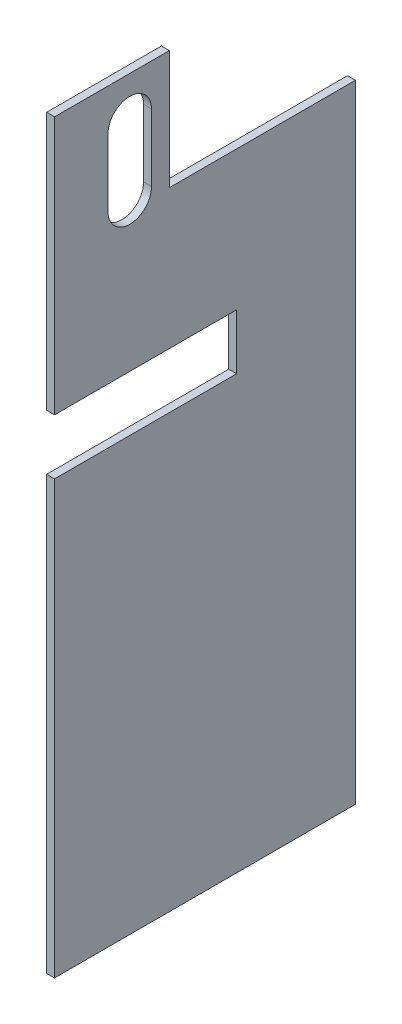
ISO-10303-21;
HEADER;
FILE_DESCRIPTION(('STEP AP214'),'2;1');
FILE_NAME('part.step','',(''),(''),'','','');
FILE_SCHEMA(('AUTOMOTIVE_DESIGN { 1 0 10303 214 1 1 1 1 }'));
ENDSEC;
DATA;
#1=APPLICATION_CONTEXT('core data for automotive mechanical design processes');
#2=APPLICATION_PROTOCOL_DEFINITION('international standard','automotive_design',2000,#1);
#3=PRODUCT_CONTEXT('',#1,'mechanical');
#4=PRODUCT('Part','Part','',(#3));
#5=PRODUCT_RELATED_PRODUCT_CATEGORY('part','',(#4));
#6=PRODUCT_DEFINITION_FORMATION('','',#4);
#7=PRODUCT_DEFINITION_CONTEXT('part definition',#1,'design');
#8=PRODUCT_DEFINITION('design','',#6,#7);
#9=PRODUCT_DEFINITION_SHAPE('','',#8);
#10=(LENGTH_UNIT() NAMED_UNIT(*) SI_UNIT(.MILLI.,.METRE.));
#11=(NAMED_UNIT(*) PLANE_ANGLE_UNIT() SI_UNIT($,.RADIAN.));
#12=(NAMED_UNIT(*) SI_UNIT($,.STERADIAN.) SOLID_ANGLE_UNIT());
#13=UNCERTAINTY_MEASURE_WITH_UNIT(LENGTH_MEASURE(1.E-05),#10,'distance_accuracy_value','');
#14=(GEOMETRIC_REPRESENTATION_CONTEXT(3) GLOBAL_UNCERTAINTY_ASSIGNED_CONTEXT((#13)) GLOBAL_UNIT_ASSIGNED_CONTEXT((#10,
#11,#12)) REPRESENTATION_CONTEXT('',''));
#15=CARTESIAN_POINT('',(0.,0.,0.));
#16=DIRECTION('',(0.,0.,1.));
#17=DIRECTION('',(1.,0.,0.));
#18=AXIS2_PLACEMENT_3D('',#15,#16,#17);
#19=CARTESIAN_POINT('',(10.,616.,0.));
#20=DIRECTION('',(0.,1.,0.));
#21=DIRECTION('',(0.,0.,1.));
#22=AXIS2_PLACEMENT_3D('',#19,#20,#21);
#23=PLANE('',#22);
#24=DIRECTION('',(0.,0.,-1.));
#25=VECTOR('',#24,1.);
#26=CARTESIAN_POINT('',(0.,616.,0.));
#27=LINE('',#26,#25);
#28=CARTESIAN_POINT('',(0.,616.,0.));
#29=VERTEX_POINT('',#28);
#30=CARTESIAN_POINT('',(0.,616.,-230.));
#31=VERTEX_POINT('',#30);
#32=EDGE_CURVE('E186',#29,#31,#27,.T.);
#33=ORIENTED_EDGE('',*,*,#32,.T.);
#34=DIRECTION('',(-1.,0.,0.));
#35=VECTOR('',#34,1.);
#36=CARTESIAN_POINT('',(10.,616.,-230.));
#37=LINE('',#36,#35);
#38=CARTESIAN_POINT('',(10.,616.,-230.));
#39=VERTEX_POINT('',#38);
#40=EDGE_CURVE('E11',#39,#31,#37,.T.);
#41=ORIENTED_EDGE('',*,*,#40,.F.);
#42=DIRECTION('',(0.,0.,-1.));
#43=VECTOR('',#42,1.);
#44=CARTESIAN_POINT('',(10.,616.,0.));
#45=LINE('',#44,#43);
#46=CARTESIAN_POINT('',(10.,616.,0.));
#47=VERTEX_POINT('',#46);
#48=EDGE_CURVE('E250',#47,#39,#45,.T.);
#49=ORIENTED_EDGE('',*,*,#48,.F.);
#50=DIRECTION('',(-1.,0.,0.));
#51=VECTOR('',#50,1.);
#52=CARTESIAN_POINT('',(10.,616.,0.));
#53=LINE('',#52,#51);
#54=EDGE_CURVE('E55',#47,#29,#53,.T.);
#55=ORIENTED_EDGE('',*,*,#54,.T.);
#56=EDGE_LOOP('',(#33,#41,#49,#55));
#57=FACE_BOUND('',#56,.T.);
#58=ADVANCED_FACE('F36',(#57),#23,.F.);
#59=CARTESIAN_POINT('',(10.,0.,-230.));
#60=DIRECTION('',(0.,0.,-1.));
#61=DIRECTION('',(0.,1.,0.));
#62=AXIS2_PLACEMENT_3D('',#59,#60,#61);
#63=PLANE('',#62);
#64=DIRECTION('',(0.,-1.,0.));
#65=VECTOR('',#64,1.);
#66=CARTESIAN_POINT('',(0.,0.,-230.));
#67=LINE('',#66,#65);
#68=CARTESIAN_POINT('',(0.,546.,-230.));
#69=VERTEX_POINT('',#68);
#70=EDGE_CURVE('E188',#31,#69,#67,.T.);
#71=ORIENTED_EDGE('',*,*,#70,.T.);
#72=DIRECTION('',(-1.,0.,0.));
#73=VECTOR('',#72,1.);
#74=CARTESIAN_POINT('',(10.,546.,-230.));
#75=LINE('',#74,#73);
#76=CARTESIAN_POINT('',(10.,546.,-230.));
#77=VERTEX_POINT('',#76);
#78=EDGE_CURVE('E46',#77,#69,#75,.T.);
#79=ORIENTED_EDGE('',*,*,#78,.F.);
#80=DIRECTION('',(0.,-1.,0.));
#81=VECTOR('',#80,1.);
#82=CARTESIAN_POINT('',(10.,0.,-230.));
#83=LINE('',#82,#81);
#84=EDGE_CURVE('E257',#39,#77,#83,.T.);
#85=ORIENTED_EDGE('',*,*,#84,.F.);
#86=ORIENTED_EDGE('',*,*,#40,.T.);
#87=EDGE_LOOP('',(#71,#79,#85,#86));
#88=FACE_BOUND('',#87,.T.);
#89=ADVANCED_FACE('F286',(#88),#63,.F.);
#90=CARTESIAN_POINT('',(10.,546.,0.));
#91=DIRECTION('',(0.,1.,0.));
#92=DIRECTION('',(0.,0.,1.));
#93=AXIS2_PLACEMENT_3D('',#90,#91,#92);
#94=PLANE('',#93);
#95=DIRECTION('',(0.,0.,-1.));
#96=VECTOR('',#95,1.);
#97=CARTESIAN_POINT('',(0.,546.,0.));
#98=LINE('',#97,#96);
#99=CARTESIAN_POINT('',(0.,546.,0.));
#100=VERTEX_POINT('',#99);
#101=EDGE_CURVE('E191',#100,#69,#98,.T.);
#102=ORIENTED_EDGE('',*,*,#101,.F.);
#103=DIRECTION('',(-1.,0.,0.));
#104=VECTOR('',#103,1.);
#105=CARTESIAN_POINT('',(10.,546.,0.));
#106=LINE('',#105,#104);
#107=CARTESIAN_POINT('',(10.,546.,0.));
#108=VERTEX_POINT('',#107);
#109=EDGE_CURVE('E222',#108,#100,#106,.T.);
#110=ORIENTED_EDGE('',*,*,#109,.F.);
#111=DIRECTION('',(0.,0.,-1.));
#112=VECTOR('',#111,1.);
#113=CARTESIAN_POINT('',(10.,546.,0.));
#114=LINE('',#113,#112);
#115=EDGE_CURVE('E259',#108,#77,#114,.T.);
#116=ORIENTED_EDGE('',*,*,#115,.T.);
#117=ORIENTED_EDGE('',*,*,#78,.T.);
#118=EDGE_LOOP('',(#102,#110,#116,#117));
#119=FACE_BOUND('',#118,.T.);
#120=ADVANCED_FACE('F291',(#119),#94,.T.);
#121=CARTESIAN_POINT('',(10.,0.,0.));
#122=DIRECTION('',(0.,0.,1.));
#123=DIRECTION('',(0.,-1.,0.));
#124=AXIS2_PLACEMENT_3D('',#121,#122,#123);
#125=PLANE('',#124);
#126=DIRECTION('',(0.,1.,0.));
#127=VECTOR('',#126,1.);
#128=CARTESIAN_POINT('',(0.,0.,0.));
#129=LINE('',#128,#127);
#130=CARTESIAN_POINT('',(0.,0.,0.));
#131=VERTEX_POINT('',#130);
#132=EDGE_CURVE('E194',#131,#100,#129,.T.);
#133=ORIENTED_EDGE('',*,*,#132,.F.);
#134=DIRECTION('',(-1.,0.,0.));
#135=VECTOR('',#134,1.);
#136=CARTESIAN_POINT('',(10.,0.,0.));
#137=LINE('',#136,#135);
#138=CARTESIAN_POINT('',(10.,0.,0.));
#139=VERTEX_POINT('',#138);
#140=EDGE_CURVE('E220',#139,#131,#137,.T.);
#141=ORIENTED_EDGE('',*,*,#140,.F.);
#142=DIRECTION('',(0.,1.,0.));
#143=VECTOR('',#142,1.);
#144=CARTESIAN_POINT('',(10.,0.,0.));
#145=LINE('',#144,#143);
#146=EDGE_CURVE('E262',#139,#108,#145,.T.);
#147=ORIENTED_EDGE('',*,*,#146,.T.);
#148=ORIENTED_EDGE('',*,*,#109,.T.);
#149=EDGE_LOOP('',(#133,#141,#147,#148));
#150=FACE_BOUND('',#149,.T.);
#151=ADVANCED_FACE('F318',(#150),#125,.T.);
#152=CARTESIAN_POINT('',(10.,0.,0.));
#153=DIRECTION('',(0.,-1.,0.));
#154=DIRECTION('',(0.,0.,-1.));
#155=AXIS2_PLACEMENT_3D('',#152,#153,#154);
#156=PLANE('',#155);
#157=DIRECTION('',(0.,0.,1.));
#158=VECTOR('',#157,1.);
#159=CARTESIAN_POINT('',(0.,0.,0.));
#160=LINE('',#159,#158);
#161=CARTESIAN_POINT('',(0.,0.,-380.));
#162=VERTEX_POINT('',#161);
#163=EDGE_CURVE('E197',#162,#131,#160,.T.);
#164=ORIENTED_EDGE('',*,*,#163,.F.);
#165=DIRECTION('',(-1.,0.,0.));
#166=VECTOR('',#165,1.);
#167=CARTESIAN_POINT('',(10.,0.,-380.));
#168=LINE('',#167,#166);
#169=CARTESIAN_POINT('',(10.,0.,-380.));
#170=VERTEX_POINT('',#169);
#171=EDGE_CURVE('E218',#170,#162,#168,.T.);
#172=ORIENTED_EDGE('',*,*,#171,.F.);
#173=DIRECTION('',(0.,0.,1.));
#174=VECTOR('',#173,1.);
#175=CARTESIAN_POINT('',(10.,0.,0.));
#176=LINE('',#175,#174);
#177=EDGE_CURVE('E265',#170,#139,#176,.T.);
#178=ORIENTED_EDGE('',*,*,#177,.T.);
#179=ORIENTED_EDGE('',*,*,#140,.T.);
#180=EDGE_LOOP('',(#164,#172,#178,#179));
#181=FACE_BOUND('',#180,.T.);
#182=ADVANCED_FACE('F314',(#181),#156,.T.);
#183=CARTESIAN_POINT('',(10.,0.,-380.));
#184=DIRECTION('',(0.,0.,-1.));
#185=DIRECTION('',(0.,1.,0.));
#186=AXIS2_PLACEMENT_3D('',#183,#184,#185);
#187=PLANE('',#186);
#188=DIRECTION('',(0.,-1.,0.));
#189=VECTOR('',#188,1.);
#190=CARTESIAN_POINT('',(0.,0.,-380.));
#191=LINE('',#190,#189);
#192=CARTESIAN_POINT('',(0.,792.,-380.));
#193=VERTEX_POINT('',#192);
#194=EDGE_CURVE('E200',#193,#162,#191,.T.);
#195=ORIENTED_EDGE('',*,*,#194,.F.);
#196=DIRECTION('',(-1.,0.,0.));
#197=VECTOR('',#196,1.);
#198=CARTESIAN_POINT('',(10.,792.,-380.));
#199=LINE('',#198,#197);
#200=CARTESIAN_POINT('',(10.,792.,-380.));
#201=VERTEX_POINT('',#200);
#202=EDGE_CURVE('E216',#201,#193,#199,.T.);
#203=ORIENTED_EDGE('',*,*,#202,.F.);
#204=DIRECTION('',(0.,-1.,0.));
#205=VECTOR('',#204,1.);
#206=CARTESIAN_POINT('',(10.,0.,-380.));
#207=LINE('',#206,#205);
#208=EDGE_CURVE('E268',#201,#170,#207,.T.);
#209=ORIENTED_EDGE('',*,*,#208,.T.);
#210=ORIENTED_EDGE('',*,*,#171,.T.);
#211=EDGE_LOOP('',(#195,#203,#209,#210));
#212=FACE_BOUND('',#211,.T.);
#213=ADVANCED_FACE('F311',(#212),#187,.T.);
#214=CARTESIAN_POINT('',(10.,792.,0.));
#215=DIRECTION('',(0.,1.,0.));
#216=DIRECTION('',(0.,0.,1.));
#217=AXIS2_PLACEMENT_3D('',#214,#215,#216);
#218=PLANE('',#217);
#219=DIRECTION('',(0.,0.,-1.));
#220=VECTOR('',#219,1.);
#221=CARTESIAN_POINT('',(0.,792.,0.));
#222=LINE('',#221,#220);
#223=CARTESIAN_POINT('',(0.,792.,-145.));
#224=VERTEX_POINT('',#223);
#225=EDGE_CURVE('E203',#224,#193,#222,.T.);
#226=ORIENTED_EDGE('',*,*,#225,.F.);
#227=DIRECTION('',(-1.,0.,0.));
#228=VECTOR('',#227,1.);
#229=CARTESIAN_POINT('',(10.,792.,-145.));
#230=LINE('',#229,#228);
#231=CARTESIAN_POINT('',(10.,792.,-145.));
#232=VERTEX_POINT('',#231);
#233=EDGE_CURVE('E154',#232,#224,#230,.T.);
#234=ORIENTED_EDGE('',*,*,#233,.F.);
#235=DIRECTION('',(0.,0.,-1.));
#236=VECTOR('',#235,1.);
#237=CARTESIAN_POINT('',(10.,792.,0.));
#238=LINE('',#237,#236);
#239=EDGE_CURVE('E165',#232,#201,#238,.T.);
#240=ORIENTED_EDGE('',*,*,#239,.T.);
#241=ORIENTED_EDGE('',*,*,#202,.T.);
#242=EDGE_LOOP('',(#226,#234,#240,#241));
#243=FACE_BOUND('',#242,.T.);
#244=ADVANCED_FACE('F272',(#243),#218,.T.);
#245=CARTESIAN_POINT('',(10.,0.,-145.));
#246=DIRECTION('',(0.,0.,-1.));
#247=DIRECTION('',(0.,1.,0.));
#248=AXIS2_PLACEMENT_3D('',#245,#246,#247);
#249=PLANE('',#248);
#250=DIRECTION('',(0.,-1.,0.));
#251=VECTOR('',#250,1.);
#252=CARTESIAN_POINT('',(0.,0.,-145.));
#253=LINE('',#252,#251);
#254=CARTESIAN_POINT('',(0.,942.,-145.));
#255=VERTEX_POINT('',#254);
#256=EDGE_CURVE('E150',#255,#224,#253,.T.);
#257=ORIENTED_EDGE('',*,*,#256,.F.);
#258=DIRECTION('',(-1.,0.,0.));
#259=VECTOR('',#258,1.);
#260=CARTESIAN_POINT('',(10.,942.,-145.));
#261=LINE('',#260,#259);
#262=CARTESIAN_POINT('',(10.,942.,-145.));
#263=VERTEX_POINT('',#262);
#264=EDGE_CURVE('E145',#263,#255,#261,.T.);
#265=ORIENTED_EDGE('',*,*,#264,.F.);
#266=DIRECTION('',(0.,-1.,0.));
#267=VECTOR('',#266,1.);
#268=CARTESIAN_POINT('',(10.,0.,-145.));
#269=LINE('',#268,#267);
#270=EDGE_CURVE('E148',#263,#232,#269,.T.);
#271=ORIENTED_EDGE('',*,*,#270,.T.);
#272=ORIENTED_EDGE('',*,*,#233,.T.);
#273=EDGE_LOOP('',(#257,#265,#271,#272));
#274=FACE_BOUND('',#273,.T.);
#275=ADVANCED_FACE('F147',(#274),#249,.T.);
#276=CARTESIAN_POINT('',(10.,942.,0.));
#277=DIRECTION('',(0.,1.,0.));
#278=DIRECTION('',(0.,0.,1.));
#279=AXIS2_PLACEMENT_3D('',#276,#277,#278);
#280=PLANE('',#279);
#281=DIRECTION('',(0.,0.,-1.));
#282=VECTOR('',#281,1.);
#283=CARTESIAN_POINT('',(0.,942.,0.));
#284=LINE('',#283,#282);
#285=CARTESIAN_POINT('',(0.,942.,0.));
#286=VERTEX_POINT('',#285);
#287=EDGE_CURVE('E207',#286,#255,#284,.T.);
#288=ORIENTED_EDGE('',*,*,#287,.F.);
#289=DIRECTION('',(-1.,0.,0.));
#290=VECTOR('',#289,1.);
#291=CARTESIAN_POINT('',(10.,942.,0.));
#292=LINE('',#291,#290);
#293=CARTESIAN_POINT('',(10.,942.,0.));
#294=VERTEX_POINT('',#293);
#295=EDGE_CURVE('E99',#294,#286,#292,.T.);
#296=ORIENTED_EDGE('',*,*,#295,.F.);
#297=DIRECTION('',(0.,0.,-1.));
#298=VECTOR('',#297,1.);
#299=CARTESIAN_POINT('',(10.,942.,0.));
#300=LINE('',#299,#298);
#301=EDGE_CURVE('E162',#294,#263,#300,.T.);
#302=ORIENTED_EDGE('',*,*,#301,.T.);
#303=ORIENTED_EDGE('',*,*,#264,.T.);
#304=EDGE_LOOP('',(#288,#296,#302,#303));
#305=FACE_BOUND('',#304,.T.);
#306=ADVANCED_FACE('F167',(#305),#280,.T.);
#307=CARTESIAN_POINT('',(10.,804.5,-95.));
#308=DIRECTION('',(-1.,0.,0.));
#309=DIRECTION('',(0.,0.,1.));
#310=AXIS2_PLACEMENT_3D('',#307,#308,#309);
#311=CYLINDRICAL_SURFACE('',#310,27.5);
#312=CARTESIAN_POINT('',(0.,804.5,-95.));
#313=DIRECTION('',(1.,0.,0.));
#314=DIRECTION('',(0.,0.,-1.));
#315=AXIS2_PLACEMENT_3D('',#312,#313,#314);
#316=CIRCLE('',#315,27.5);
#317=CARTESIAN_POINT('',(0.,804.5,-67.5));
#318=VERTEX_POINT('',#317);
#319=CARTESIAN_POINT('',(0.,804.5,-122.5));
#320=VERTEX_POINT('',#319);
#321=EDGE_CURVE('E174',#318,#320,#316,.T.);
#322=ORIENTED_EDGE('',*,*,#321,.F.);
#323=DIRECTION('',(-1.,0.,0.));
#324=VECTOR('',#323,1.);
#325=CARTESIAN_POINT('',(10.,804.5,-67.5));
#326=LINE('',#325,#324);
#327=CARTESIAN_POINT('',(10.,804.5,-67.5));
#328=VERTEX_POINT('',#327);
#329=EDGE_CURVE('E40',#328,#318,#326,.T.);
#330=ORIENTED_EDGE('',*,*,#329,.F.);
#331=CARTESIAN_POINT('',(10.,804.5,-95.));
#332=DIRECTION('',(1.,0.,0.));
#333=DIRECTION('',(0.,0.,-1.));
#334=AXIS2_PLACEMENT_3D('',#331,#332,#333);
#335=CIRCLE('',#334,27.5);
#336=CARTESIAN_POINT('',(10.,804.5,-122.5));
#337=VERTEX_POINT('',#336);
#338=EDGE_CURVE('E212',#328,#337,#335,.T.);
#339=ORIENTED_EDGE('',*,*,#338,.T.);
#340=DIRECTION('',(-1.,0.,0.));
#341=VECTOR('',#340,1.);
#342=CARTESIAN_POINT('',(10.,804.5,-122.5));
#343=LINE('',#342,#341);
#344=EDGE_CURVE('E170',#337,#320,#343,.T.);
#345=ORIENTED_EDGE('',*,*,#344,.T.);
#346=EDGE_LOOP('',(#322,#330,#339,#345));
#347=FACE_BOUND('',#346,.T.);
#348=ADVANCED_FACE('F38',(#347),#311,.F.);
#349=CARTESIAN_POINT('',(10.,0.,-67.5));
#350=DIRECTION('',(0.,0.,-1.));
#351=DIRECTION('',(-1.,0.,0.));
#352=AXIS2_PLACEMENT_3D('',#349,#350,#351);
#353=PLANE('',#352);
#354=DIRECTION('',(0.,-1.,0.));
#355=VECTOR('',#354,1.);
#356=CARTESIAN_POINT('',(0.,0.,-67.5));
#357=LINE('',#356,#355);
#358=CARTESIAN_POINT('',(0.,889.5,-67.5));
#359=VERTEX_POINT('',#358);
#360=EDGE_CURVE('E177',#359,#318,#357,.T.);
#361=ORIENTED_EDGE('',*,*,#360,.F.);
#362=DIRECTION('',(-1.,0.,0.));
#363=VECTOR('',#362,1.);
#364=CARTESIAN_POINT('',(10.,889.5,-67.5));
#365=LINE('',#364,#363);
#366=CARTESIAN_POINT('',(10.,889.5,-67.5));
#367=VERTEX_POINT('',#366);
#368=EDGE_CURVE('E227',#367,#359,#365,.T.);
#369=ORIENTED_EDGE('',*,*,#368,.F.);
#370=DIRECTION('',(0.,-1.,0.));
#371=VECTOR('',#370,1.);
#372=CARTESIAN_POINT('',(10.,0.,-67.5));
#373=LINE('',#372,#371);
#374=EDGE_CURVE('E236',#367,#328,#373,.T.);
#375=ORIENTED_EDGE('',*,*,#374,.T.);
#376=ORIENTED_EDGE('',*,*,#329,.T.);
#377=EDGE_LOOP('',(#361,#369,#375,#376));
#378=FACE_BOUND('',#377,.T.);
#379=ADVANCED_FACE('F234',(#378),#353,.T.);
#380=CARTESIAN_POINT('',(10.,889.5,-95.));
#381=DIRECTION('',(-1.,0.,0.));
#382=DIRECTION('',(0.,0.,1.));
#383=AXIS2_PLACEMENT_3D('',#380,#381,#382);
#384=CYLINDRICAL_SURFACE('',#383,27.5);
#385=CARTESIAN_POINT('',(0.,889.5,-95.));
#386=DIRECTION('',(1.,0.,0.));
#387=DIRECTION('',(0.,0.,-1.));
#388=AXIS2_PLACEMENT_3D('',#385,#386,#387);
#389=CIRCLE('',#388,27.5);
#390=CARTESIAN_POINT('',(0.,889.5,-122.5));
#391=VERTEX_POINT('',#390);
#392=EDGE_CURVE('E180',#391,#359,#389,.T.);
#393=ORIENTED_EDGE('',*,*,#392,.F.);
#394=DIRECTION('',(-1.,0.,0.));
#395=VECTOR('',#394,1.);
#396=CARTESIAN_POINT('',(10.,889.5,-122.5));
#397=LINE('',#396,#395);
#398=CARTESIAN_POINT('',(10.,889.5,-122.5));
#399=VERTEX_POINT('',#398);
#400=EDGE_CURVE('E226',#399,#391,#397,.T.);
#401=ORIENTED_EDGE('',*,*,#400,.F.);
#402=CARTESIAN_POINT('',(10.,889.5,-95.));
#403=DIRECTION('',(1.,0.,0.));
#404=DIRECTION('',(0.,0.,-1.));
#405=AXIS2_PLACEMENT_3D('',#402,#403,#404);
#406=CIRCLE('',#405,27.5);
#407=EDGE_CURVE('E245',#399,#367,#406,.T.);
#408=ORIENTED_EDGE('',*,*,#407,.T.);
#409=ORIENTED_EDGE('',*,*,#368,.T.);
#410=EDGE_LOOP('',(#393,#401,#408,#409));
#411=FACE_BOUND('',#410,.T.);
#412=ADVANCED_FACE('F242',(#411),#384,.F.);
#413=CARTESIAN_POINT('',(10.,0.,-122.5));
#414=DIRECTION('',(0.,0.,-1.));
#415=DIRECTION('',(0.,1.,0.));
#416=AXIS2_PLACEMENT_3D('',#413,#414,#415);
#417=PLANE('',#416);
#418=DIRECTION('',(0.,-1.,0.));
#419=VECTOR('',#418,1.);
#420=CARTESIAN_POINT('',(0.,0.,-122.5));
#421=LINE('',#420,#419);
#422=EDGE_CURVE('E183',#391,#320,#421,.T.);
#423=ORIENTED_EDGE('',*,*,#422,.T.);
#424=ORIENTED_EDGE('',*,*,#344,.F.);
#425=DIRECTION('',(0.,-1.,0.));
#426=VECTOR('',#425,1.);
#427=CARTESIAN_POINT('',(10.,0.,-122.5));
#428=LINE('',#427,#426);
#429=EDGE_CURVE('E247',#399,#337,#428,.T.);
#430=ORIENTED_EDGE('',*,*,#429,.F.);
#431=ORIENTED_EDGE('',*,*,#400,.T.);
#432=EDGE_LOOP('',(#423,#424,#430,#431));
#433=FACE_BOUND('',#432,.T.);
#434=ADVANCED_FACE('F248',(#433),#417,.F.);
#435=CARTESIAN_POINT('',(10.,0.,0.));
#436=DIRECTION('',(0.,0.,1.));
#437=DIRECTION('',(0.,-1.,0.));
#438=AXIS2_PLACEMENT_3D('',#435,#436,#437);
#439=PLANE('',#438);
#440=DIRECTION('',(0.,1.,0.));
#441=VECTOR('',#440,1.);
#442=CARTESIAN_POINT('',(0.,0.,0.));
#443=LINE('',#442,#441);
#444=EDGE_CURVE('E209',#29,#286,#443,.T.);
#445=ORIENTED_EDGE('',*,*,#444,.F.);
#446=ORIENTED_EDGE('',*,*,#54,.F.);
#447=DIRECTION('',(0.,1.,0.));
#448=VECTOR('',#447,1.);
#449=CARTESIAN_POINT('',(10.,0.,0.));
#450=LINE('',#449,#448);
#451=EDGE_CURVE('E168',#47,#294,#450,.T.);
#452=ORIENTED_EDGE('',*,*,#451,.T.);
#453=ORIENTED_EDGE('',*,*,#295,.T.);
#454=EDGE_LOOP('',(#445,#446,#452,#453));
#455=FACE_BOUND('',#454,.T.);
#456=ADVANCED_FACE('F274',(#455),#439,.T.);
#457=CARTESIAN_POINT('',(10.,0.,0.));
#458=DIRECTION('',(1.,0.,0.));
#459=DIRECTION('',(0.,0.,-1.));
#460=AXIS2_PLACEMENT_3D('',#457,#458,#459);
#461=PLANE('',#460);
#462=ORIENTED_EDGE('',*,*,#338,.F.);
#463=ORIENTED_EDGE('',*,*,#374,.F.);
#464=ORIENTED_EDGE('',*,*,#407,.F.);
#465=ORIENTED_EDGE('',*,*,#429,.T.);
#466=EDGE_LOOP('',(#462,#463,#464,#465));
#467=FACE_BOUND('',#466,.T.);
#468=ORIENTED_EDGE('',*,*,#48,.T.);
#469=ORIENTED_EDGE('',*,*,#84,.T.);
#470=ORIENTED_EDGE('',*,*,#115,.F.);
#471=ORIENTED_EDGE('',*,*,#146,.F.);
#472=ORIENTED_EDGE('',*,*,#177,.F.);
#473=ORIENTED_EDGE('',*,*,#208,.F.);
#474=ORIENTED_EDGE('',*,*,#239,.F.);
#475=ORIENTED_EDGE('',*,*,#270,.F.);
#476=ORIENTED_EDGE('',*,*,#301,.F.);
#477=ORIENTED_EDGE('',*,*,#451,.F.);
#478=EDGE_LOOP('',(#468,#469,#470,#471,#472,#473,#474,#475,#476,#477));
#479=FACE_BOUND('',#478,.T.);
#480=ADVANCED_FACE('F160',(#467,#479),#461,.T.);
#481=CARTESIAN_POINT('',(0.,0.,0.));
#482=DIRECTION('',(1.,0.,0.));
#483=DIRECTION('',(0.,0.,-1.));
#484=AXIS2_PLACEMENT_3D('',#481,#482,#483);
#485=PLANE('',#484);
#486=ORIENTED_EDGE('',*,*,#321,.T.);
#487=ORIENTED_EDGE('',*,*,#422,.F.);
#488=ORIENTED_EDGE('',*,*,#392,.T.);
#489=ORIENTED_EDGE('',*,*,#360,.T.);
#490=EDGE_LOOP('',(#486,#487,#488,#489));
#491=FACE_BOUND('',#490,.T.);
#492=ORIENTED_EDGE('',*,*,#32,.F.);
#493=ORIENTED_EDGE('',*,*,#444,.T.);
#494=ORIENTED_EDGE('',*,*,#287,.T.);
#495=ORIENTED_EDGE('',*,*,#256,.T.);
#496=ORIENTED_EDGE('',*,*,#225,.T.);
#497=ORIENTED_EDGE('',*,*,#194,.T.);
#498=ORIENTED_EDGE('',*,*,#163,.T.);
#499=ORIENTED_EDGE('',*,*,#132,.T.);
#500=ORIENTED_EDGE('',*,*,#101,.T.);
#501=ORIENTED_EDGE('',*,*,#70,.F.);
#502=EDGE_LOOP('',(#492,#493,#494,#495,#496,#497,#498,#499,#500,#501));
#503=FACE_BOUND('',#502,.T.);
#504=ADVANCED_FACE('F240',(#491,#503),#485,.F.);
#505=CLOSED_SHELL('',(#58,#89,#120,#151,#182,#213,#244,#275,#306,#348,#379,#412,#434,#456,#480,#504));
#506=MANIFOLD_SOLID_BREP('B2',#505);
#507=ADVANCED_BREP_SHAPE_REPRESENTATION('',(#18,#506),#14);
#508=SHAPE_DEFINITION_REPRESENTATION(#9,#507);
ENDSEC;
END-ISO-10303-21;
